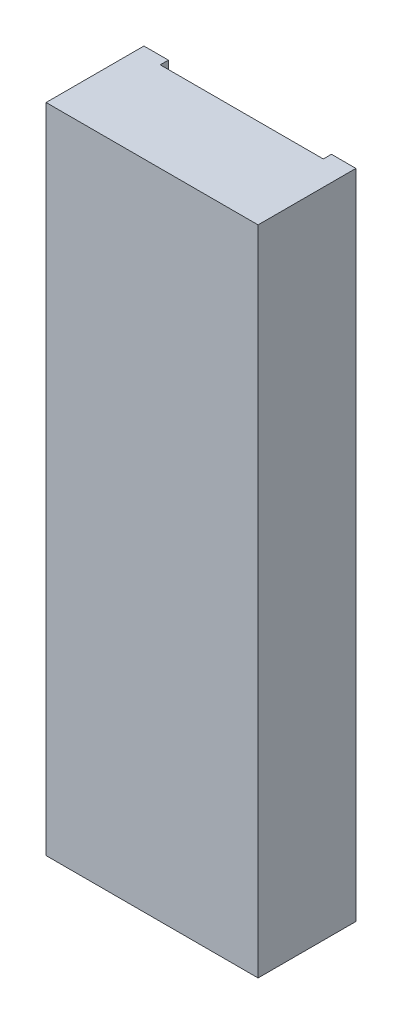
ISO-10303-21;
HEADER;
FILE_DESCRIPTION(('STEP AP214'),'2;1');
FILE_NAME('part.step','',(''),(''),'','','');
FILE_SCHEMA(('AUTOMOTIVE_DESIGN { 1 0 10303 214 1 1 1 1 }'));
ENDSEC;
DATA;
#1=APPLICATION_CONTEXT('core data for automotive mechanical design processes');
#2=APPLICATION_PROTOCOL_DEFINITION('international standard','automotive_design',2000,#1);
#3=PRODUCT_CONTEXT('',#1,'mechanical');
#4=PRODUCT('Part','Part','',(#3));
#5=PRODUCT_RELATED_PRODUCT_CATEGORY('part','',(#4));
#6=PRODUCT_DEFINITION_FORMATION('','',#4);
#7=PRODUCT_DEFINITION_CONTEXT('part definition',#1,'design');
#8=PRODUCT_DEFINITION('design','',#6,#7);
#9=PRODUCT_DEFINITION_SHAPE('','',#8);
#10=(LENGTH_UNIT() NAMED_UNIT(*) SI_UNIT(.MILLI.,.METRE.));
#11=(NAMED_UNIT(*) PLANE_ANGLE_UNIT() SI_UNIT($,.RADIAN.));
#12=(NAMED_UNIT(*) SI_UNIT($,.STERADIAN.) SOLID_ANGLE_UNIT());
#13=UNCERTAINTY_MEASURE_WITH_UNIT(LENGTH_MEASURE(1.E-05),#10,'distance_accuracy_value','');
#14=(GEOMETRIC_REPRESENTATION_CONTEXT(3) GLOBAL_UNCERTAINTY_ASSIGNED_CONTEXT((#13)) GLOBAL_UNIT_ASSIGNED_CONTEXT((#10,
#11,#12)) REPRESENTATION_CONTEXT('',''));
#15=CARTESIAN_POINT('',(0.,0.,0.));
#16=DIRECTION('',(0.,0.,1.));
#17=DIRECTION('',(1.,0.,0.));
#18=AXIS2_PLACEMENT_3D('',#15,#16,#17);
#19=CARTESIAN_POINT('',(0.,0.,0.));
#20=DIRECTION('',(0.,0.,1.));
#21=DIRECTION('',(1.,0.,0.));
#22=AXIS2_PLACEMENT_3D('',#19,#20,#21);
#23=PLANE('',#22);
#24=DIRECTION('',(-1.,0.,0.));
#25=VECTOR('',#24,1.);
#26=CARTESIAN_POINT('',(-65.,200.,0.));
#27=LINE('',#26,#25);
#28=CARTESIAN_POINT('',(-50.,200.,0.));
#29=VERTEX_POINT('',#28);
#30=CARTESIAN_POINT('',(-65.,200.,0.));
#31=VERTEX_POINT('',#30);
#32=EDGE_CURVE('E151',#29,#31,#27,.T.);
#33=ORIENTED_EDGE('',*,*,#32,.F.);
#34=DIRECTION('',(0.,1.,0.));
#35=VECTOR('',#34,1.);
#36=CARTESIAN_POINT('',(-50.,200.,0.));
#37=LINE('',#36,#35);
#38=CARTESIAN_POINT('',(-50.,-200.,0.));
#39=VERTEX_POINT('',#38);
#40=EDGE_CURVE('E112',#39,#29,#37,.T.);
#41=ORIENTED_EDGE('',*,*,#40,.F.);
#42=DIRECTION('',(1.,0.,0.));
#43=VECTOR('',#42,1.);
#44=CARTESIAN_POINT('',(-65.,-200.,0.));
#45=LINE('',#44,#43);
#46=CARTESIAN_POINT('',(-65.,-200.,0.));
#47=VERTEX_POINT('',#46);
#48=EDGE_CURVE('E143',#47,#39,#45,.T.);
#49=ORIENTED_EDGE('',*,*,#48,.F.);
#50=DIRECTION('',(0.,-1.,0.));
#51=VECTOR('',#50,1.);
#52=CARTESIAN_POINT('',(-65.,200.,0.));
#53=LINE('',#52,#51);
#54=EDGE_CURVE('E154',#31,#47,#53,.T.);
#55=ORIENTED_EDGE('',*,*,#54,.F.);
#56=EDGE_LOOP('',(#33,#41,#49,#55));
#57=FACE_BOUND('',#56,.T.);
#58=ADVANCED_FACE('F33',(#57),#23,.F.);
#59=CARTESIAN_POINT('',(65.,200.,60.));
#60=DIRECTION('',(-1.,0.,0.));
#61=DIRECTION('',(0.,-1.,0.));
#62=AXIS2_PLACEMENT_3D('',#59,#60,#61);
#63=PLANE('',#62);
#64=DIRECTION('',(0.,1.,0.));
#65=VECTOR('',#64,1.);
#66=CARTESIAN_POINT('',(65.,200.,0.));
#67=LINE('',#66,#65);
#68=CARTESIAN_POINT('',(65.0000000000001,-200.,0.));
#69=VERTEX_POINT('',#68);
#70=CARTESIAN_POINT('',(65.,200.,0.));
#71=VERTEX_POINT('',#70);
#72=EDGE_CURVE('E137',#69,#71,#67,.T.);
#73=ORIENTED_EDGE('',*,*,#72,.T.);
#74=DIRECTION('',(0.,0.,-1.));
#75=VECTOR('',#74,1.);
#76=CARTESIAN_POINT('',(65.,200.,60.));
#77=LINE('',#76,#75);
#78=CARTESIAN_POINT('',(65.,200.,60.));
#79=VERTEX_POINT('',#78);
#80=EDGE_CURVE('E11',#79,#71,#77,.T.);
#81=ORIENTED_EDGE('',*,*,#80,.F.);
#82=DIRECTION('',(0.,1.,0.));
#83=VECTOR('',#82,1.);
#84=CARTESIAN_POINT('',(65.,200.,60.));
#85=LINE('',#84,#83);
#86=CARTESIAN_POINT('',(65.0000000000001,-200.,60.));
#87=VERTEX_POINT('',#86);
#88=EDGE_CURVE('E141',#87,#79,#85,.T.);
#89=ORIENTED_EDGE('',*,*,#88,.F.);
#90=DIRECTION('',(0.,0.,-1.));
#91=VECTOR('',#90,1.);
#92=CARTESIAN_POINT('',(65.0000000000001,-200.,60.));
#93=LINE('',#92,#91);
#94=EDGE_CURVE('E148',#87,#69,#93,.T.);
#95=ORIENTED_EDGE('',*,*,#94,.T.);
#96=EDGE_LOOP('',(#73,#81,#89,#95));
#97=FACE_BOUND('',#96,.T.);
#98=ADVANCED_FACE('F35',(#97),#63,.F.);
#99=CARTESIAN_POINT('',(-65.,200.,60.));
#100=DIRECTION('',(0.,-1.,0.));
#101=DIRECTION('',(0.,0.,-1.));
#102=AXIS2_PLACEMENT_3D('',#99,#100,#101);
#103=PLANE('',#102);
#104=DIRECTION('',(1.,0.,0.));
#105=VECTOR('',#104,1.);
#106=CARTESIAN_POINT('',(50.,200.,5.));
#107=LINE('',#106,#105);
#108=CARTESIAN_POINT('',(-50.,200.,5.));
#109=VERTEX_POINT('',#108);
#110=CARTESIAN_POINT('',(50.,200.,5.));
#111=VERTEX_POINT('',#110);
#112=EDGE_CURVE('E121',#109,#111,#107,.T.);
#113=ORIENTED_EDGE('',*,*,#112,.F.);
#114=DIRECTION('',(0.,0.,-1.));
#115=VECTOR('',#114,1.);
#116=CARTESIAN_POINT('',(-50.,200.,5.));
#117=LINE('',#116,#115);
#118=EDGE_CURVE('E106',#109,#29,#117,.T.);
#119=ORIENTED_EDGE('',*,*,#118,.T.);
#120=ORIENTED_EDGE('',*,*,#32,.T.);
#121=DIRECTION('',(0.,0.,-1.));
#122=VECTOR('',#121,1.);
#123=CARTESIAN_POINT('',(-65.,200.,60.));
#124=LINE('',#123,#122);
#125=CARTESIAN_POINT('',(-65.,200.,60.));
#126=VERTEX_POINT('',#125);
#127=EDGE_CURVE('E41',#126,#31,#124,.T.);
#128=ORIENTED_EDGE('',*,*,#127,.F.);
#129=DIRECTION('',(-1.,0.,0.));
#130=VECTOR('',#129,1.);
#131=CARTESIAN_POINT('',(-65.,200.,60.));
#132=LINE('',#131,#130);
#133=EDGE_CURVE('E85',#79,#126,#132,.T.);
#134=ORIENTED_EDGE('',*,*,#133,.F.);
#135=ORIENTED_EDGE('',*,*,#80,.T.);
#136=CARTESIAN_POINT('',(50.,200.,0.));
#137=VERTEX_POINT('',#136);
#138=EDGE_CURVE('E152',#71,#137,#27,.T.);
#139=ORIENTED_EDGE('',*,*,#138,.T.);
#140=DIRECTION('',(0.,0.,-1.));
#141=VECTOR('',#140,1.);
#142=CARTESIAN_POINT('',(50.,200.,5.));
#143=LINE('',#142,#141);
#144=EDGE_CURVE('E48',#111,#137,#143,.T.);
#145=ORIENTED_EDGE('',*,*,#144,.F.);
#146=EDGE_LOOP('',(#113,#119,#120,#128,#134,#135,#139,#145));
#147=FACE_BOUND('',#146,.T.);
#148=ADVANCED_FACE('F126',(#147),#103,.F.);
#149=CARTESIAN_POINT('',(-65.,200.,60.));
#150=DIRECTION('',(1.,0.,0.));
#151=DIRECTION('',(0.,1.,0.));
#152=AXIS2_PLACEMENT_3D('',#149,#150,#151);
#153=PLANE('',#152);
#154=ORIENTED_EDGE('',*,*,#54,.T.);
#155=DIRECTION('',(0.,0.,-1.));
#156=VECTOR('',#155,1.);
#157=CARTESIAN_POINT('',(-65.,-200.,60.));
#158=LINE('',#157,#156);
#159=CARTESIAN_POINT('',(-65.,-200.,60.));
#160=VERTEX_POINT('',#159);
#161=EDGE_CURVE('E159',#160,#47,#158,.T.);
#162=ORIENTED_EDGE('',*,*,#161,.F.);
#163=DIRECTION('',(0.,-1.,0.));
#164=VECTOR('',#163,1.);
#165=CARTESIAN_POINT('',(-65.,200.,60.));
#166=LINE('',#165,#164);
#167=EDGE_CURVE('E145',#126,#160,#166,.T.);
#168=ORIENTED_EDGE('',*,*,#167,.F.);
#169=ORIENTED_EDGE('',*,*,#127,.T.);
#170=EDGE_LOOP('',(#154,#162,#168,#169));
#171=FACE_BOUND('',#170,.T.);
#172=ADVANCED_FACE('F165',(#171),#153,.F.);
#173=CARTESIAN_POINT('',(-65.,-200.,60.));
#174=DIRECTION('',(0.,1.,0.));
#175=DIRECTION('',(0.,0.,1.));
#176=AXIS2_PLACEMENT_3D('',#173,#174,#175);
#177=PLANE('',#176);
#178=ORIENTED_EDGE('',*,*,#48,.T.);
#179=DIRECTION('',(0.,0.,-1.));
#180=VECTOR('',#179,1.);
#181=CARTESIAN_POINT('',(-50.,-200.,5.));
#182=LINE('',#181,#180);
#183=CARTESIAN_POINT('',(-50.,-200.,5.));
#184=VERTEX_POINT('',#183);
#185=EDGE_CURVE('E135',#184,#39,#182,.T.);
#186=ORIENTED_EDGE('',*,*,#185,.F.);
#187=DIRECTION('',(-1.,0.,0.));
#188=VECTOR('',#187,1.);
#189=CARTESIAN_POINT('',(50.,-200.,5.));
#190=LINE('',#189,#188);
#191=CARTESIAN_POINT('',(50.,-200.,5.));
#192=VERTEX_POINT('',#191);
#193=EDGE_CURVE('E115',#192,#184,#190,.T.);
#194=ORIENTED_EDGE('',*,*,#193,.F.);
#195=DIRECTION('',(0.,0.,-1.));
#196=VECTOR('',#195,1.);
#197=CARTESIAN_POINT('',(50.,-200.,5.));
#198=LINE('',#197,#196);
#199=CARTESIAN_POINT('',(50.,-200.,0.));
#200=VERTEX_POINT('',#199);
#201=EDGE_CURVE('E138',#192,#200,#198,.T.);
#202=ORIENTED_EDGE('',*,*,#201,.T.);
#203=EDGE_CURVE('E78',#200,#69,#45,.T.);
#204=ORIENTED_EDGE('',*,*,#203,.T.);
#205=ORIENTED_EDGE('',*,*,#94,.F.);
#206=DIRECTION('',(1.,0.,0.));
#207=VECTOR('',#206,1.);
#208=CARTESIAN_POINT('',(-65.,-200.,60.));
#209=LINE('',#208,#207);
#210=EDGE_CURVE('E57',#160,#87,#209,.T.);
#211=ORIENTED_EDGE('',*,*,#210,.F.);
#212=ORIENTED_EDGE('',*,*,#161,.T.);
#213=EDGE_LOOP('',(#178,#186,#194,#202,#204,#205,#211,#212));
#214=FACE_BOUND('',#213,.T.);
#215=ADVANCED_FACE('F169',(#214),#177,.F.);
#216=CARTESIAN_POINT('',(0.,0.,60.));
#217=DIRECTION('',(0.,0.,1.));
#218=DIRECTION('',(1.,0.,0.));
#219=AXIS2_PLACEMENT_3D('',#216,#217,#218);
#220=PLANE('',#219);
#221=ORIENTED_EDGE('',*,*,#88,.T.);
#222=ORIENTED_EDGE('',*,*,#133,.T.);
#223=ORIENTED_EDGE('',*,*,#167,.T.);
#224=ORIENTED_EDGE('',*,*,#210,.T.);
#225=EDGE_LOOP('',(#221,#222,#223,#224));
#226=FACE_BOUND('',#225,.T.);
#227=ADVANCED_FACE('F174',(#226),#220,.T.);
#228=ORIENTED_EDGE('',*,*,#203,.F.);
#229=DIRECTION('',(0.,-1.,0.));
#230=VECTOR('',#229,1.);
#231=CARTESIAN_POINT('',(50.,200.,0.));
#232=LINE('',#231,#230);
#233=EDGE_CURVE('E124',#137,#200,#232,.T.);
#234=ORIENTED_EDGE('',*,*,#233,.F.);
#235=ORIENTED_EDGE('',*,*,#138,.F.);
#236=ORIENTED_EDGE('',*,*,#72,.F.);
#237=EDGE_LOOP('',(#228,#234,#235,#236));
#238=FACE_BOUND('',#237,.T.);
#239=ADVANCED_FACE('F176',(#238),#23,.F.);
#240=CARTESIAN_POINT('',(-50.,200.,5.));
#241=DIRECTION('',(-1.,0.,0.));
#242=DIRECTION('',(0.,0.,1.));
#243=AXIS2_PLACEMENT_3D('',#240,#241,#242);
#244=PLANE('',#243);
#245=ORIENTED_EDGE('',*,*,#40,.T.);
#246=ORIENTED_EDGE('',*,*,#118,.F.);
#247=DIRECTION('',(0.,1.,0.));
#248=VECTOR('',#247,1.);
#249=CARTESIAN_POINT('',(-50.,200.,5.));
#250=LINE('',#249,#248);
#251=EDGE_CURVE('E109',#184,#109,#250,.T.);
#252=ORIENTED_EDGE('',*,*,#251,.F.);
#253=ORIENTED_EDGE('',*,*,#185,.T.);
#254=EDGE_LOOP('',(#245,#246,#252,#253));
#255=FACE_BOUND('',#254,.T.);
#256=ADVANCED_FACE('F108',(#255),#244,.F.);
#257=CARTESIAN_POINT('',(50.,200.,5.));
#258=DIRECTION('',(1.,0.,0.));
#259=DIRECTION('',(0.,0.,-1.));
#260=AXIS2_PLACEMENT_3D('',#257,#258,#259);
#261=PLANE('',#260);
#262=ORIENTED_EDGE('',*,*,#233,.T.);
#263=ORIENTED_EDGE('',*,*,#201,.F.);
#264=DIRECTION('',(0.,-1.,0.));
#265=VECTOR('',#264,1.);
#266=CARTESIAN_POINT('',(50.,200.,5.));
#267=LINE('',#266,#265);
#268=EDGE_CURVE('E128',#111,#192,#267,.T.);
#269=ORIENTED_EDGE('',*,*,#268,.F.);
#270=ORIENTED_EDGE('',*,*,#144,.T.);
#271=EDGE_LOOP('',(#262,#263,#269,#270));
#272=FACE_BOUND('',#271,.T.);
#273=ADVANCED_FACE('F222',(#272),#261,.F.);
#274=CARTESIAN_POINT('',(0.,0.,5.));
#275=DIRECTION('',(0.,0.,-1.));
#276=DIRECTION('',(-1.,0.,0.));
#277=AXIS2_PLACEMENT_3D('',#274,#275,#276);
#278=PLANE('',#277);
#279=ORIENTED_EDGE('',*,*,#251,.T.);
#280=ORIENTED_EDGE('',*,*,#112,.T.);
#281=ORIENTED_EDGE('',*,*,#268,.T.);
#282=ORIENTED_EDGE('',*,*,#193,.T.);
#283=EDGE_LOOP('',(#279,#280,#281,#282));
#284=FACE_BOUND('',#283,.T.);
#285=ADVANCED_FACE('F119',(#284),#278,.T.);
#286=CLOSED_SHELL('',(#58,#98,#148,#172,#215,#227,#239,#256,#273,#285));
#287=MANIFOLD_SOLID_BREP('B2',#286);
#288=ADVANCED_BREP_SHAPE_REPRESENTATION('',(#18,#287),#14);
#289=SHAPE_DEFINITION_REPRESENTATION(#9,#288);
ENDSEC;
END-ISO-10303-21;
